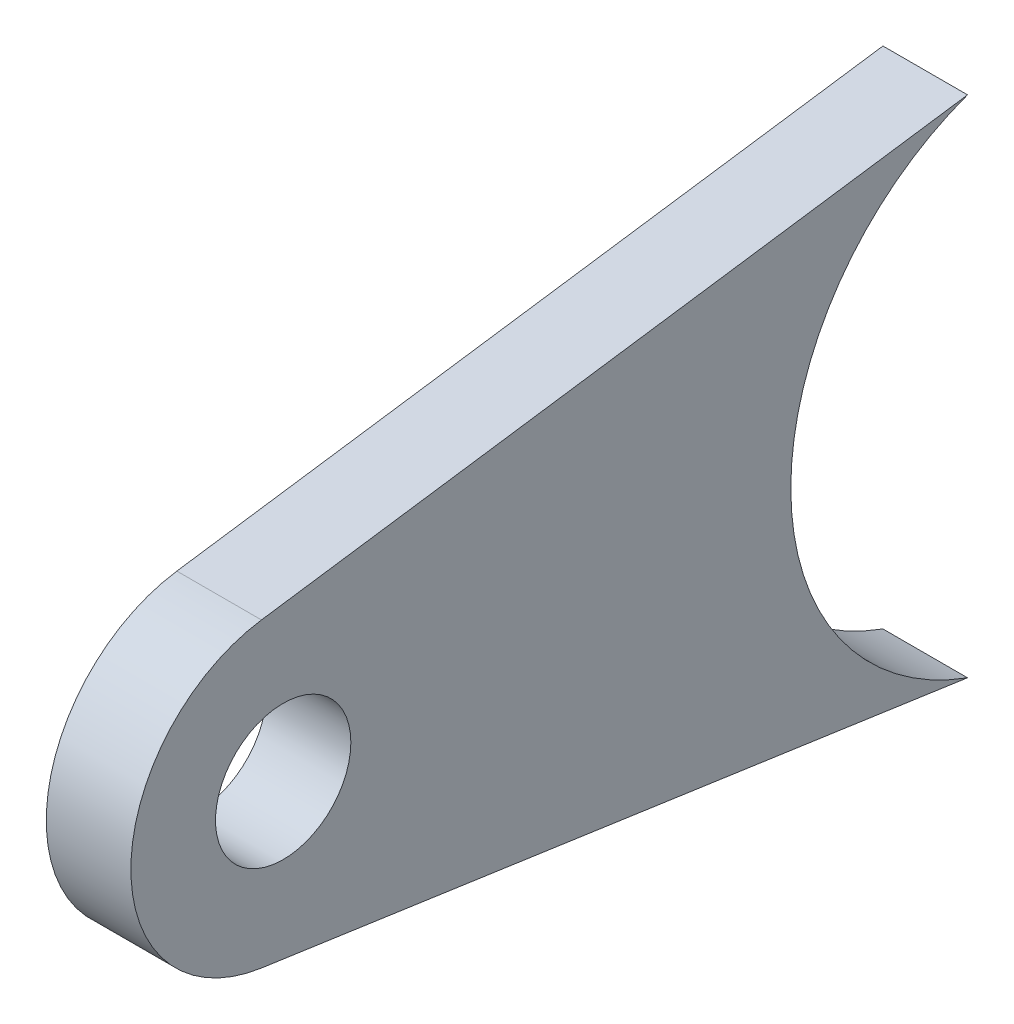
ISO-10303-21;
HEADER;
FILE_DESCRIPTION(('STEP AP214'),'2;1');
FILE_NAME('part.step','',(''),(''),'','','');
FILE_SCHEMA(('AUTOMOTIVE_DESIGN { 1 0 10303 214 1 1 1 1 }'));
ENDSEC;
DATA;
#1=APPLICATION_CONTEXT('core data for automotive mechanical design processes');
#2=APPLICATION_PROTOCOL_DEFINITION('international standard','automotive_design',2000,#1);
#3=PRODUCT_CONTEXT('',#1,'mechanical');
#4=PRODUCT('Part','Part','',(#3));
#5=PRODUCT_RELATED_PRODUCT_CATEGORY('part','',(#4));
#6=PRODUCT_DEFINITION_FORMATION('','',#4);
#7=PRODUCT_DEFINITION_CONTEXT('part definition',#1,'design');
#8=PRODUCT_DEFINITION('design','',#6,#7);
#9=PRODUCT_DEFINITION_SHAPE('','',#8);
#10=(LENGTH_UNIT() NAMED_UNIT(*) SI_UNIT(.MILLI.,.METRE.));
#11=(NAMED_UNIT(*) PLANE_ANGLE_UNIT() SI_UNIT($,.RADIAN.));
#12=(NAMED_UNIT(*) SI_UNIT($,.STERADIAN.) SOLID_ANGLE_UNIT());
#13=UNCERTAINTY_MEASURE_WITH_UNIT(LENGTH_MEASURE(1.E-05),#10,'distance_accuracy_value','');
#14=(GEOMETRIC_REPRESENTATION_CONTEXT(3) GLOBAL_UNCERTAINTY_ASSIGNED_CONTEXT((#13)) GLOBAL_UNIT_ASSIGNED_CONTEXT((#10,
#11,#12)) REPRESENTATION_CONTEXT('',''));
#15=CARTESIAN_POINT('',(0.,0.,0.));
#16=DIRECTION('',(0.,0.,1.));
#17=DIRECTION('',(1.,0.,0.));
#18=AXIS2_PLACEMENT_3D('',#15,#16,#17);
#19=CARTESIAN_POINT('',(2.5,15.380562515601,2.21503880851972));
#20=DIRECTION('',(0.,0.989788347419978,0.142544825622081));
#21=DIRECTION('',(0.,-0.142544825622081,0.989788347419978));
#22=AXIS2_PLACEMENT_3D('',#19,#20,#21);
#23=PLANE('',#22);
#24=DIRECTION('',(0.,0.142544825622081,-0.989788347419978));
#25=VECTOR('',#24,1.);
#26=CARTESIAN_POINT('',(-2.5,15.380562515601,2.21503880851972));
#27=LINE('',#26,#25);
#28=CARTESIAN_POINT('',(-2.5,8.9080951267798,47.1579034305987));
#29=VERTEX_POINT('',#28);
#30=CARTESIAN_POINT('',(-2.5,14.9176203549763,5.429569775295));
#31=VERTEX_POINT('',#30);
#32=EDGE_CURVE('E112',#29,#31,#27,.T.);
#33=ORIENTED_EDGE('',*,*,#32,.F.);
#34=DIRECTION('',(-1.,0.,0.));
#35=VECTOR('',#34,1.);
#36=CARTESIAN_POINT('',(2.5,8.9080951267798,47.1579034305987));
#37=LINE('',#36,#35);
#38=CARTESIAN_POINT('',(2.5,8.9080951267798,47.1579034305987));
#39=VERTEX_POINT('',#38);
#40=EDGE_CURVE('E11',#39,#29,#37,.T.);
#41=ORIENTED_EDGE('',*,*,#40,.F.);
#42=DIRECTION('',(0.,0.142544825622081,-0.989788347419978));
#43=VECTOR('',#42,1.);
#44=CARTESIAN_POINT('',(2.5,15.380562515601,2.21503880851972));
#45=LINE('',#44,#43);
#46=CARTESIAN_POINT('',(2.5,14.9176203549763,5.429569775295));
#47=VERTEX_POINT('',#46);
#48=EDGE_CURVE('E96',#39,#47,#45,.T.);
#49=ORIENTED_EDGE('',*,*,#48,.T.);
#50=DIRECTION('',(-1.,0.,0.));
#51=VECTOR('',#50,1.);
#52=CARTESIAN_POINT('',(2.5,14.9176203549763,5.429569775295));
#53=LINE('',#52,#51);
#54=EDGE_CURVE('E58',#47,#31,#53,.T.);
#55=ORIENTED_EDGE('',*,*,#54,.T.);
#56=EDGE_LOOP('',(#33,#41,#49,#55));
#57=FACE_BOUND('',#56,.T.);
#58=ADVANCED_FACE('F41',(#57),#23,.T.);
#59=CARTESIAN_POINT('',(2.5,0.,45.875));
#60=DIRECTION('',(-1.,0.,0.));
#61=DIRECTION('',(0.,0.,1.));
#62=AXIS2_PLACEMENT_3D('',#59,#60,#61);
#63=CYLINDRICAL_SURFACE('',#62,9.);
#64=CARTESIAN_POINT('',(-2.5,0.,45.875));
#65=DIRECTION('',(1.,0.,0.));
#66=DIRECTION('',(0.,0.,-1.));
#67=AXIS2_PLACEMENT_3D('',#64,#65,#66);
#68=CIRCLE('',#67,9.);
#69=CARTESIAN_POINT('',(-2.5,-8.9080951267798,47.1579034305987));
#70=VERTEX_POINT('',#69);
#71=EDGE_CURVE('E101',#29,#70,#68,.T.);
#72=ORIENTED_EDGE('',*,*,#71,.T.);
#73=DIRECTION('',(-1.,0.,0.));
#74=VECTOR('',#73,1.);
#75=CARTESIAN_POINT('',(2.5,-8.9080951267798,47.1579034305987));
#76=LINE('',#75,#74);
#77=CARTESIAN_POINT('',(2.5,-8.9080951267798,47.1579034305987));
#78=VERTEX_POINT('',#77);
#79=EDGE_CURVE('E50',#78,#70,#76,.T.);
#80=ORIENTED_EDGE('',*,*,#79,.F.);
#81=CARTESIAN_POINT('',(2.5,0.,45.875));
#82=DIRECTION('',(1.,0.,0.));
#83=DIRECTION('',(0.,0.,-1.));
#84=AXIS2_PLACEMENT_3D('',#81,#82,#83);
#85=CIRCLE('',#84,9.);
#86=EDGE_CURVE('E92',#39,#78,#85,.T.);
#87=ORIENTED_EDGE('',*,*,#86,.F.);
#88=ORIENTED_EDGE('',*,*,#40,.T.);
#89=EDGE_LOOP('',(#72,#80,#87,#88));
#90=FACE_BOUND('',#89,.T.);
#91=ADVANCED_FACE('F99',(#90),#63,.T.);
#92=CARTESIAN_POINT('',(2.5,-15.380562515601,2.21503880851972));
#93=DIRECTION('',(0.,0.989788347419978,-0.142544825622081));
#94=DIRECTION('',(0.,0.142544825622081,0.989788347419978));
#95=AXIS2_PLACEMENT_3D('',#92,#93,#94);
#96=PLANE('',#95);
#97=DIRECTION('',(0.,-0.142544825622081,-0.989788347419978));
#98=VECTOR('',#97,1.);
#99=CARTESIAN_POINT('',(-2.5,-15.380562515601,2.21503880851972));
#100=LINE('',#99,#98);
#101=CARTESIAN_POINT('',(-2.5,-14.9176203549763,5.42956977529501));
#102=VERTEX_POINT('',#101);
#103=EDGE_CURVE('E109',#70,#102,#100,.T.);
#104=ORIENTED_EDGE('',*,*,#103,.T.);
#105=DIRECTION('',(-1.,0.,0.));
#106=VECTOR('',#105,1.);
#107=CARTESIAN_POINT('',(2.5,-14.9176203549763,5.42956977529501));
#108=LINE('',#107,#106);
#109=CARTESIAN_POINT('',(2.5,-14.9176203549763,5.42956977529501));
#110=VERTEX_POINT('',#109);
#111=EDGE_CURVE('E72',#110,#102,#108,.T.);
#112=ORIENTED_EDGE('',*,*,#111,.F.);
#113=DIRECTION('',(0.,-0.142544825622081,-0.989788347419978));
#114=VECTOR('',#113,1.);
#115=CARTESIAN_POINT('',(2.5,-15.380562515601,2.21503880851972));
#116=LINE('',#115,#114);
#117=EDGE_CURVE('E84',#78,#110,#116,.T.);
#118=ORIENTED_EDGE('',*,*,#117,.F.);
#119=ORIENTED_EDGE('',*,*,#79,.T.);
#120=EDGE_LOOP('',(#104,#112,#118,#119));
#121=FACE_BOUND('',#120,.T.);
#122=ADVANCED_FACE('F86',(#121),#96,.F.);
#123=CARTESIAN_POINT('',(2.5,0.,45.875));
#124=DIRECTION('',(-1.,0.,0.));
#125=DIRECTION('',(0.,0.,1.));
#126=AXIS2_PLACEMENT_3D('',#123,#124,#125);
#127=CYLINDRICAL_SURFACE('',#126,4.);
#128=CARTESIAN_POINT('',(2.5,0.,45.875));
#129=DIRECTION('',(1.,0.,0.));
#130=DIRECTION('',(0.,0.,-1.));
#131=AXIS2_PLACEMENT_3D('',#128,#129,#130);
#132=CIRCLE('',#131,4.);
#133=CARTESIAN_POINT('',(2.5,0.,41.875));
#134=VERTEX_POINT('',#133);
#135=EDGE_CURVE('E108',#134,#134,#132,.T.);
#136=ORIENTED_EDGE('',*,*,#135,.T.);
#137=EDGE_LOOP('',(#136));
#138=FACE_BOUND('',#137,.T.);
#139=CARTESIAN_POINT('',(-2.5,0.,45.875));
#140=DIRECTION('',(1.,0.,0.));
#141=DIRECTION('',(0.,0.,-1.));
#142=AXIS2_PLACEMENT_3D('',#139,#140,#141);
#143=CIRCLE('',#142,4.);
#144=CARTESIAN_POINT('',(-2.5,0.,41.875));
#145=VERTEX_POINT('',#144);
#146=EDGE_CURVE('E114',#145,#145,#143,.T.);
#147=ORIENTED_EDGE('',*,*,#146,.F.);
#148=EDGE_LOOP('',(#147));
#149=FACE_BOUND('',#148,.T.);
#150=ADVANCED_FACE('F43',(#138,#149),#127,.F.);
#151=CARTESIAN_POINT('',(2.5,0.,0.));
#152=DIRECTION('',(-1.,0.,0.));
#153=DIRECTION('',(0.,0.,1.));
#154=AXIS2_PLACEMENT_3D('',#151,#152,#153);
#155=CYLINDRICAL_SURFACE('',#154,15.875);
#156=CARTESIAN_POINT('',(-2.5,0.,0.));
#157=DIRECTION('',(1.,0.,0.));
#158=DIRECTION('',(0.,0.,-1.));
#159=AXIS2_PLACEMENT_3D('',#156,#157,#158);
#160=CIRCLE('',#159,15.875);
#161=EDGE_CURVE('E105',#31,#102,#160,.T.);
#162=ORIENTED_EDGE('',*,*,#161,.F.);
#163=ORIENTED_EDGE('',*,*,#54,.F.);
#164=CARTESIAN_POINT('',(2.5,0.,0.));
#165=DIRECTION('',(1.,0.,0.));
#166=DIRECTION('',(0.,0.,-1.));
#167=AXIS2_PLACEMENT_3D('',#164,#165,#166);
#168=CIRCLE('',#167,15.875);
#169=EDGE_CURVE('E91',#47,#110,#168,.T.);
#170=ORIENTED_EDGE('',*,*,#169,.T.);
#171=ORIENTED_EDGE('',*,*,#111,.T.);
#172=EDGE_LOOP('',(#162,#163,#170,#171));
#173=FACE_BOUND('',#172,.T.);
#174=ADVANCED_FACE('F126',(#173),#155,.F.);
#175=CARTESIAN_POINT('',(2.5,0.,0.));
#176=DIRECTION('',(1.,0.,0.));
#177=DIRECTION('',(0.,0.,-1.));
#178=AXIS2_PLACEMENT_3D('',#175,#176,#177);
#179=PLANE('',#178);
#180=ORIENTED_EDGE('',*,*,#135,.F.);
#181=EDGE_LOOP('',(#180));
#182=FACE_BOUND('',#181,.T.);
#183=ORIENTED_EDGE('',*,*,#48,.F.);
#184=ORIENTED_EDGE('',*,*,#86,.T.);
#185=ORIENTED_EDGE('',*,*,#117,.T.);
#186=ORIENTED_EDGE('',*,*,#169,.F.);
#187=EDGE_LOOP('',(#183,#184,#185,#186));
#188=FACE_BOUND('',#187,.T.);
#189=ADVANCED_FACE('F95',(#182,#188),#179,.T.);
#190=CARTESIAN_POINT('',(-2.5,0.,0.));
#191=DIRECTION('',(1.,0.,0.));
#192=DIRECTION('',(0.,0.,-1.));
#193=AXIS2_PLACEMENT_3D('',#190,#191,#192);
#194=PLANE('',#193);
#195=ORIENTED_EDGE('',*,*,#146,.T.);
#196=EDGE_LOOP('',(#195));
#197=FACE_BOUND('',#196,.T.);
#198=ORIENTED_EDGE('',*,*,#32,.T.);
#199=ORIENTED_EDGE('',*,*,#161,.T.);
#200=ORIENTED_EDGE('',*,*,#103,.F.);
#201=ORIENTED_EDGE('',*,*,#71,.F.);
#202=EDGE_LOOP('',(#198,#199,#200,#201));
#203=FACE_BOUND('',#202,.T.);
#204=ADVANCED_FACE('F125',(#197,#203),#194,.F.);
#205=CLOSED_SHELL('',(#58,#91,#122,#150,#174,#189,#204));
#206=MANIFOLD_SOLID_BREP('B2',#205);
#207=ADVANCED_BREP_SHAPE_REPRESENTATION('',(#18,#206),#14);
#208=SHAPE_DEFINITION_REPRESENTATION(#9,#207);
ENDSEC;
END-ISO-10303-21;
